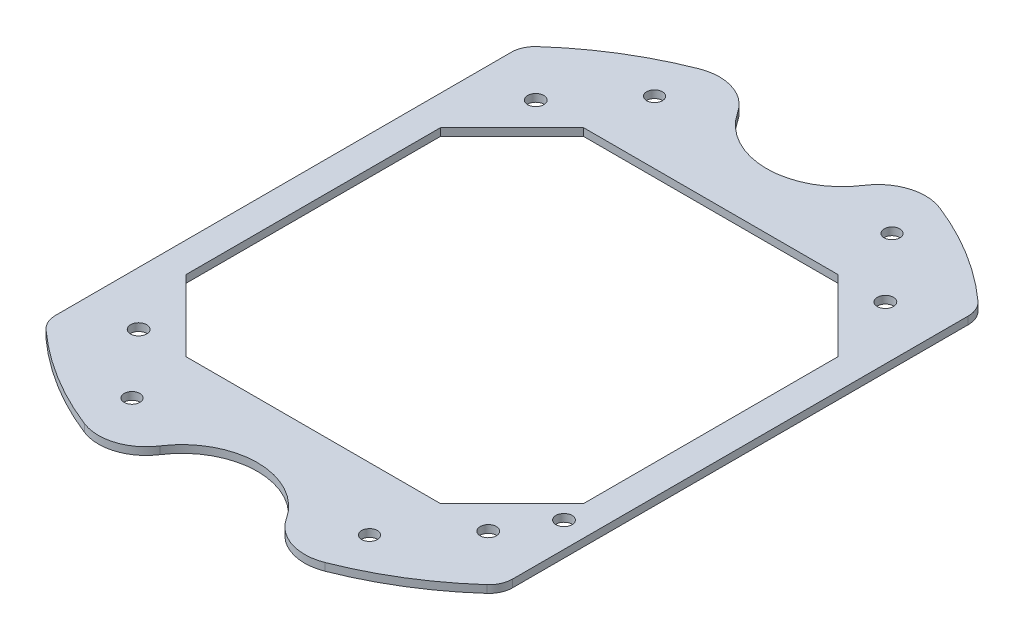
ISO-10303-21;
HEADER;
FILE_DESCRIPTION(('STEP AP214'),'2;1');
FILE_NAME('part.step','',(''),(''),'','','');
FILE_SCHEMA(('AUTOMOTIVE_DESIGN { 1 0 10303 214 1 1 1 1 }'));
ENDSEC;
DATA;
#1=APPLICATION_CONTEXT('core data for automotive mechanical design processes');
#2=APPLICATION_PROTOCOL_DEFINITION('international standard','automotive_design',2000,#1);
#3=PRODUCT_CONTEXT('',#1,'mechanical');
#4=PRODUCT('Part','Part','',(#3));
#5=PRODUCT_RELATED_PRODUCT_CATEGORY('part','',(#4));
#6=PRODUCT_DEFINITION_FORMATION('','',#4);
#7=PRODUCT_DEFINITION_CONTEXT('part definition',#1,'design');
#8=PRODUCT_DEFINITION('design','',#6,#7);
#9=PRODUCT_DEFINITION_SHAPE('','',#8);
#10=(LENGTH_UNIT() NAMED_UNIT(*) SI_UNIT(.MILLI.,.METRE.));
#11=(NAMED_UNIT(*) PLANE_ANGLE_UNIT() SI_UNIT($,.RADIAN.));
#12=(NAMED_UNIT(*) SI_UNIT($,.STERADIAN.) SOLID_ANGLE_UNIT());
#13=UNCERTAINTY_MEASURE_WITH_UNIT(LENGTH_MEASURE(1.E-05),#10,'distance_accuracy_value','');
#14=(GEOMETRIC_REPRESENTATION_CONTEXT(3) GLOBAL_UNCERTAINTY_ASSIGNED_CONTEXT((#13)) GLOBAL_UNIT_ASSIGNED_CONTEXT((#10,
#11,#12)) REPRESENTATION_CONTEXT('',''));
#15=CARTESIAN_POINT('',(0.,0.,0.));
#16=DIRECTION('',(0.,0.,1.));
#17=DIRECTION('',(1.,0.,0.));
#18=AXIS2_PLACEMENT_3D('',#15,#16,#17);
#19=CARTESIAN_POINT('',(21.6963601903997,-1.6,55.369936928702));
#20=DIRECTION('',(0.,1.,0.));
#21=DIRECTION('',(0.,0.,1.));
#22=AXIS2_PLACEMENT_3D('',#19,#20,#21);
#23=CYLINDRICAL_SURFACE('',#22,10.);
#24=CARTESIAN_POINT('',(21.6963601903997,0.,55.369936928702));
#25=DIRECTION('',(0.,1.,0.));
#26=DIRECTION('',(0.,0.,1.));
#27=AXIS2_PLACEMENT_3D('',#24,#25,#26);
#28=CIRCLE('',#27,10.);
#29=CARTESIAN_POINT('',(13.3112934501486,0.,60.8188501929717));
#30=VERTEX_POINT('',#29);
#31=CARTESIAN_POINT('',(25.3447081011431,0.,64.6806596462022));
#32=VERTEX_POINT('',#31);
#33=EDGE_CURVE('E419',#30,#32,#28,.T.);
#34=ORIENTED_EDGE('',*,*,#33,.F.);
#35=DIRECTION('',(0.,1.,0.));
#36=VECTOR('',#35,1.);
#37=CARTESIAN_POINT('',(13.3112934501486,-1.6,60.8188501929717));
#38=LINE('',#37,#36);
#39=CARTESIAN_POINT('',(13.3112934501486,-1.6,60.8188501929717));
#40=VERTEX_POINT('',#39);
#41=EDGE_CURVE('E12',#40,#30,#38,.T.);
#42=ORIENTED_EDGE('',*,*,#41,.F.);
#43=CARTESIAN_POINT('',(21.6963601903997,-1.6,55.369936928702));
#44=DIRECTION('',(0.,1.,0.));
#45=DIRECTION('',(0.,0.,1.));
#46=AXIS2_PLACEMENT_3D('',#43,#44,#45);
#47=CIRCLE('',#46,10.);
#48=CARTESIAN_POINT('',(25.3447081011431,-1.6,64.6806596462022));
#49=VERTEX_POINT('',#48);
#50=EDGE_CURVE('E420',#40,#49,#47,.T.);
#51=ORIENTED_EDGE('',*,*,#50,.T.);
#52=DIRECTION('',(0.,1.,0.));
#53=VECTOR('',#52,1.);
#54=CARTESIAN_POINT('',(25.3447081011431,-1.6,64.6806596462022));
#55=LINE('',#54,#53);
#56=EDGE_CURVE('E97',#49,#32,#55,.T.);
#57=ORIENTED_EDGE('',*,*,#56,.T.);
#58=EDGE_LOOP('',(#34,#42,#51,#57));
#59=FACE_BOUND('',#58,.T.);
#60=ADVANCED_FACE('F94',(#59),#23,.T.);
#61=CARTESIAN_POINT('',(0.,-1.6,69.469));
#62=DIRECTION('',(0.,1.,0.));
#63=DIRECTION('',(0.,0.,1.));
#64=AXIS2_PLACEMENT_3D('',#61,#62,#63);
#65=CYLINDRICAL_SURFACE('',#64,15.875);
#66=CARTESIAN_POINT('',(0.,0.,69.469));
#67=DIRECTION('',(0.,1.,0.));
#68=DIRECTION('',(0.,0.,1.));
#69=AXIS2_PLACEMENT_3D('',#66,#67,#68);
#70=CIRCLE('',#69,15.875);
#71=CARTESIAN_POINT('',(-13.3112934501486,0.,60.8188501929717));
#72=VERTEX_POINT('',#71);
#73=EDGE_CURVE('E425',#30,#72,#70,.T.);
#74=ORIENTED_EDGE('',*,*,#73,.T.);
#75=DIRECTION('',(0.,1.,0.));
#76=VECTOR('',#75,1.);
#77=CARTESIAN_POINT('',(-13.3112934501486,-1.6,60.8188501929717));
#78=LINE('',#77,#76);
#79=CARTESIAN_POINT('',(-13.3112934501486,-1.6,60.8188501929717));
#80=VERTEX_POINT('',#79);
#81=EDGE_CURVE('E103',#80,#72,#78,.T.);
#82=ORIENTED_EDGE('',*,*,#81,.F.);
#83=CARTESIAN_POINT('',(0.,-1.6,69.469));
#84=DIRECTION('',(0.,1.,0.));
#85=DIRECTION('',(0.,0.,1.));
#86=AXIS2_PLACEMENT_3D('',#83,#84,#85);
#87=CIRCLE('',#86,15.875);
#88=EDGE_CURVE('E475',#40,#80,#87,.T.);
#89=ORIENTED_EDGE('',*,*,#88,.F.);
#90=ORIENTED_EDGE('',*,*,#41,.T.);
#91=EDGE_LOOP('',(#74,#82,#89,#90));
#92=FACE_BOUND('',#91,.T.);
#93=ADVANCED_FACE('F594',(#92),#65,.F.);
#94=CARTESIAN_POINT('',(-21.6963601903997,-1.6,55.369936928702));
#95=DIRECTION('',(0.,1.,0.));
#96=DIRECTION('',(0.,0.,1.));
#97=AXIS2_PLACEMENT_3D('',#94,#95,#96);
#98=CYLINDRICAL_SURFACE('',#97,10.);
#99=CARTESIAN_POINT('',(-21.6963601903997,0.,55.369936928702));
#100=DIRECTION('',(0.,-1.,0.));
#101=DIRECTION('',(0.,0.,-1.));
#102=AXIS2_PLACEMENT_3D('',#99,#100,#101);
#103=CIRCLE('',#102,10.);
#104=CARTESIAN_POINT('',(-25.3447081011431,0.,64.6806596462022));
#105=VERTEX_POINT('',#104);
#106=EDGE_CURVE('E531',#72,#105,#103,.T.);
#107=ORIENTED_EDGE('',*,*,#106,.T.);
#108=DIRECTION('',(0.,1.,0.));
#109=VECTOR('',#108,1.);
#110=CARTESIAN_POINT('',(-25.3447081011431,-1.6,64.6806596462022));
#111=LINE('',#110,#109);
#112=CARTESIAN_POINT('',(-25.3447081011431,-1.6,64.6806596462022));
#113=VERTEX_POINT('',#112);
#114=EDGE_CURVE('E540',#113,#105,#111,.T.);
#115=ORIENTED_EDGE('',*,*,#114,.F.);
#116=CARTESIAN_POINT('',(-21.6963601903997,-1.6,55.369936928702));
#117=DIRECTION('',(0.,-1.,0.));
#118=DIRECTION('',(0.,0.,-1.));
#119=AXIS2_PLACEMENT_3D('',#116,#117,#118);
#120=CIRCLE('',#119,10.);
#121=EDGE_CURVE('E472',#80,#113,#120,.T.);
#122=ORIENTED_EDGE('',*,*,#121,.F.);
#123=ORIENTED_EDGE('',*,*,#81,.T.);
#124=EDGE_LOOP('',(#107,#115,#122,#123));
#125=FACE_BOUND('',#124,.T.);
#126=ADVANCED_FACE('F598',(#125),#98,.T.);
#127=CARTESIAN_POINT('',(0.,-1.6,0.));
#128=DIRECTION('',(0.,1.,0.));
#129=DIRECTION('',(0.,0.,1.));
#130=AXIS2_PLACEMENT_3D('',#127,#128,#129);
#131=CYLINDRICAL_SURFACE('',#130,69.469);
#132=CARTESIAN_POINT('',(0.,0.,0.));
#133=DIRECTION('',(0.,1.,0.));
#134=DIRECTION('',(0.,0.,1.));
#135=AXIS2_PLACEMENT_3D('',#132,#133,#134);
#136=CIRCLE('',#135,69.469);
#137=CARTESIAN_POINT('',(-46.4354728353846,0.,51.6690315716702));
#138=VERTEX_POINT('',#137);
#139=EDGE_CURVE('E527',#138,#105,#136,.T.);
#140=ORIENTED_EDGE('',*,*,#139,.F.);
#141=DIRECTION('',(0.,1.,0.));
#142=VECTOR('',#141,1.);
#143=CARTESIAN_POINT('',(-46.4354728353846,-1.6,51.6690315716702));
#144=LINE('',#143,#142);
#145=CARTESIAN_POINT('',(-46.4354728353846,-1.6,51.6690315716702));
#146=VERTEX_POINT('',#145);
#147=EDGE_CURVE('E543',#146,#138,#144,.T.);
#148=ORIENTED_EDGE('',*,*,#147,.F.);
#149=CARTESIAN_POINT('',(0.,-1.6,0.));
#150=DIRECTION('',(0.,1.,0.));
#151=DIRECTION('',(0.,0.,1.));
#152=AXIS2_PLACEMENT_3D('',#149,#150,#151);
#153=CIRCLE('',#152,69.469);
#154=EDGE_CURVE('E468',#146,#113,#153,.T.);
#155=ORIENTED_EDGE('',*,*,#154,.T.);
#156=ORIENTED_EDGE('',*,*,#114,.T.);
#157=EDGE_LOOP('',(#140,#148,#155,#156));
#158=FACE_BOUND('',#157,.T.);
#159=ADVANCED_FACE('F652',(#158),#131,.T.);
#160=CARTESIAN_POINT('',(-43.0933005833452,-1.6,47.9501762857391));
#161=DIRECTION('',(0.,1.,0.));
#162=DIRECTION('',(0.,0.,1.));
#163=AXIS2_PLACEMENT_3D('',#160,#161,#162);
#164=CYLINDRICAL_SURFACE('',#163,5.00000000000002);
#165=CARTESIAN_POINT('',(-43.0933005833452,0.,47.9501762857391));
#166=DIRECTION('',(0.,1.,0.));
#167=DIRECTION('',(0.,0.,1.));
#168=AXIS2_PLACEMENT_3D('',#165,#166,#167);
#169=CIRCLE('',#168,5.00000000000002);
#170=CARTESIAN_POINT('',(-48.0933005833453,0.,47.9501762857391));
#171=VERTEX_POINT('',#170);
#172=EDGE_CURVE('E523',#171,#138,#169,.T.);
#173=ORIENTED_EDGE('',*,*,#172,.F.);
#174=DIRECTION('',(0.,1.,0.));
#175=VECTOR('',#174,1.);
#176=CARTESIAN_POINT('',(-48.0933005833453,-1.6,47.9501762857391));
#177=LINE('',#176,#175);
#178=CARTESIAN_POINT('',(-48.0933005833453,-1.6,47.9501762857391));
#179=VERTEX_POINT('',#178);
#180=EDGE_CURVE('E546',#179,#171,#177,.T.);
#181=ORIENTED_EDGE('',*,*,#180,.F.);
#182=CARTESIAN_POINT('',(-43.0933005833452,-1.6,47.9501762857391));
#183=DIRECTION('',(0.,1.,0.));
#184=DIRECTION('',(0.,0.,1.));
#185=AXIS2_PLACEMENT_3D('',#182,#183,#184);
#186=CIRCLE('',#185,5.00000000000002);
#187=EDGE_CURVE('E464',#179,#146,#186,.T.);
#188=ORIENTED_EDGE('',*,*,#187,.T.);
#189=ORIENTED_EDGE('',*,*,#147,.T.);
#190=EDGE_LOOP('',(#173,#181,#188,#189));
#191=FACE_BOUND('',#190,.T.);
#192=ADVANCED_FACE('F649',(#191),#164,.T.);
#193=CARTESIAN_POINT('',(-48.0933005833453,-1.6,47.9501762857391));
#194=DIRECTION('',(1.,0.,0.));
#195=DIRECTION('',(0.,0.,-1.));
#196=AXIS2_PLACEMENT_3D('',#193,#194,#195);
#197=PLANE('',#196);
#198=DIRECTION('',(0.,0.,-1.));
#199=VECTOR('',#198,1.);
#200=CARTESIAN_POINT('',(-48.0933005833453,0.,47.9501762857391));
#201=LINE('',#200,#199);
#202=CARTESIAN_POINT('',(-48.0933005833453,0.,-47.9501762857391));
#203=VERTEX_POINT('',#202);
#204=EDGE_CURVE('E520',#171,#203,#201,.T.);
#205=ORIENTED_EDGE('',*,*,#204,.T.);
#206=DIRECTION('',(0.,1.,0.));
#207=VECTOR('',#206,1.);
#208=CARTESIAN_POINT('',(-48.0933005833453,-1.6,-47.9501762857391));
#209=LINE('',#208,#207);
#210=CARTESIAN_POINT('',(-48.0933005833453,-1.6,-47.9501762857391));
#211=VERTEX_POINT('',#210);
#212=EDGE_CURVE('E549',#211,#203,#209,.T.);
#213=ORIENTED_EDGE('',*,*,#212,.F.);
#214=DIRECTION('',(0.,0.,-1.));
#215=VECTOR('',#214,1.);
#216=CARTESIAN_POINT('',(-48.0933005833453,-1.6,47.9501762857391));
#217=LINE('',#216,#215);
#218=EDGE_CURVE('E461',#179,#211,#217,.T.);
#219=ORIENTED_EDGE('',*,*,#218,.F.);
#220=ORIENTED_EDGE('',*,*,#180,.T.);
#221=EDGE_LOOP('',(#205,#213,#219,#220));
#222=FACE_BOUND('',#221,.T.);
#223=ADVANCED_FACE('F647',(#222),#197,.F.);
#224=CARTESIAN_POINT('',(-43.0933005833452,-1.6,-47.9501762857391));
#225=DIRECTION('',(0.,1.,0.));
#226=DIRECTION('',(0.,0.,1.));
#227=AXIS2_PLACEMENT_3D('',#224,#225,#226);
#228=CYLINDRICAL_SURFACE('',#227,5.00000000000002);
#229=CARTESIAN_POINT('',(-43.0933005833452,0.,-47.9501762857391));
#230=DIRECTION('',(0.,-1.,0.));
#231=DIRECTION('',(0.,0.,-1.));
#232=AXIS2_PLACEMENT_3D('',#229,#230,#231);
#233=CIRCLE('',#232,5.00000000000002);
#234=CARTESIAN_POINT('',(-46.4354728353846,0.,-51.6690315716702));
#235=VERTEX_POINT('',#234);
#236=EDGE_CURVE('E516',#203,#235,#233,.T.);
#237=ORIENTED_EDGE('',*,*,#236,.T.);
#238=DIRECTION('',(0.,1.,0.));
#239=VECTOR('',#238,1.);
#240=CARTESIAN_POINT('',(-46.4354728353846,-1.6,-51.6690315716702));
#241=LINE('',#240,#239);
#242=CARTESIAN_POINT('',(-46.4354728353846,-1.6,-51.6690315716702));
#243=VERTEX_POINT('',#242);
#244=EDGE_CURVE('E553',#243,#235,#241,.T.);
#245=ORIENTED_EDGE('',*,*,#244,.F.);
#246=CARTESIAN_POINT('',(-43.0933005833452,-1.6,-47.9501762857391));
#247=DIRECTION('',(0.,-1.,0.));
#248=DIRECTION('',(0.,0.,-1.));
#249=AXIS2_PLACEMENT_3D('',#246,#247,#248);
#250=CIRCLE('',#249,5.00000000000002);
#251=EDGE_CURVE('E458',#211,#243,#250,.T.);
#252=ORIENTED_EDGE('',*,*,#251,.F.);
#253=ORIENTED_EDGE('',*,*,#212,.T.);
#254=EDGE_LOOP('',(#237,#245,#252,#253));
#255=FACE_BOUND('',#254,.T.);
#256=ADVANCED_FACE('F642',(#255),#228,.T.);
#257=CARTESIAN_POINT('',(0.,-1.6,0.));
#258=DIRECTION('',(0.,1.,0.));
#259=DIRECTION('',(0.,0.,1.));
#260=AXIS2_PLACEMENT_3D('',#257,#258,#259);
#261=CYLINDRICAL_SURFACE('',#260,69.469);
#262=CARTESIAN_POINT('',(0.,0.,0.));
#263=DIRECTION('',(0.,1.,0.));
#264=DIRECTION('',(0.,0.,1.));
#265=AXIS2_PLACEMENT_3D('',#262,#263,#264);
#266=CIRCLE('',#265,69.469);
#267=CARTESIAN_POINT('',(-25.3447081011431,0.,-64.6806596462022));
#268=VERTEX_POINT('',#267);
#269=EDGE_CURVE('E512',#268,#235,#266,.T.);
#270=ORIENTED_EDGE('',*,*,#269,.F.);
#271=DIRECTION('',(0.,1.,0.));
#272=VECTOR('',#271,1.);
#273=CARTESIAN_POINT('',(-25.3447081011431,-1.6,-64.6806596462022));
#274=LINE('',#273,#272);
#275=CARTESIAN_POINT('',(-25.3447081011431,-1.6,-64.6806596462022));
#276=VERTEX_POINT('',#275);
#277=EDGE_CURVE('E556',#276,#268,#274,.T.);
#278=ORIENTED_EDGE('',*,*,#277,.F.);
#279=CARTESIAN_POINT('',(0.,-1.6,0.));
#280=DIRECTION('',(0.,1.,0.));
#281=DIRECTION('',(0.,0.,1.));
#282=AXIS2_PLACEMENT_3D('',#279,#280,#281);
#283=CIRCLE('',#282,69.469);
#284=EDGE_CURVE('E454',#276,#243,#283,.T.);
#285=ORIENTED_EDGE('',*,*,#284,.T.);
#286=ORIENTED_EDGE('',*,*,#244,.T.);
#287=EDGE_LOOP('',(#270,#278,#285,#286));
#288=FACE_BOUND('',#287,.T.);
#289=ADVANCED_FACE('F636',(#288),#261,.T.);
#290=CARTESIAN_POINT('',(-21.6963601903997,-1.6,-55.369936928702));
#291=DIRECTION('',(0.,1.,0.));
#292=DIRECTION('',(0.,0.,1.));
#293=AXIS2_PLACEMENT_3D('',#290,#291,#292);
#294=CYLINDRICAL_SURFACE('',#293,10.);
#295=CARTESIAN_POINT('',(-21.6963601903997,0.,-55.369936928702));
#296=DIRECTION('',(0.,1.,0.));
#297=DIRECTION('',(0.,0.,1.));
#298=AXIS2_PLACEMENT_3D('',#295,#296,#297);
#299=CIRCLE('',#298,10.);
#300=CARTESIAN_POINT('',(-13.3112934501486,0.,-60.8188501929717));
#301=VERTEX_POINT('',#300);
#302=EDGE_CURVE('E508',#301,#268,#299,.T.);
#303=ORIENTED_EDGE('',*,*,#302,.F.);
#304=DIRECTION('',(0.,1.,0.));
#305=VECTOR('',#304,1.);
#306=CARTESIAN_POINT('',(-13.3112934501486,-1.6,-60.8188501929717));
#307=LINE('',#306,#305);
#308=CARTESIAN_POINT('',(-13.3112934501486,-1.6,-60.8188501929717));
#309=VERTEX_POINT('',#308);
#310=EDGE_CURVE('E559',#309,#301,#307,.T.);
#311=ORIENTED_EDGE('',*,*,#310,.F.);
#312=CARTESIAN_POINT('',(-21.6963601903997,-1.6,-55.369936928702));
#313=DIRECTION('',(0.,1.,0.));
#314=DIRECTION('',(0.,0.,1.));
#315=AXIS2_PLACEMENT_3D('',#312,#313,#314);
#316=CIRCLE('',#315,10.);
#317=EDGE_CURVE('E450',#309,#276,#316,.T.);
#318=ORIENTED_EDGE('',*,*,#317,.T.);
#319=ORIENTED_EDGE('',*,*,#277,.T.);
#320=EDGE_LOOP('',(#303,#311,#318,#319));
#321=FACE_BOUND('',#320,.T.);
#322=ADVANCED_FACE('F632',(#321),#294,.T.);
#323=CARTESIAN_POINT('',(0.,-1.6,-69.469));
#324=DIRECTION('',(0.,1.,0.));
#325=DIRECTION('',(0.,0.,1.));
#326=AXIS2_PLACEMENT_3D('',#323,#324,#325);
#327=CYLINDRICAL_SURFACE('',#326,15.875);
#328=CARTESIAN_POINT('',(0.,0.,-69.469));
#329=DIRECTION('',(0.,1.,0.));
#330=DIRECTION('',(0.,0.,1.));
#331=AXIS2_PLACEMENT_3D('',#328,#329,#330);
#332=CIRCLE('',#331,15.875);
#333=CARTESIAN_POINT('',(13.3112934501486,0.,-60.8188501929717));
#334=VERTEX_POINT('',#333);
#335=EDGE_CURVE('E505',#301,#334,#332,.T.);
#336=ORIENTED_EDGE('',*,*,#335,.T.);
#337=DIRECTION('',(0.,1.,0.));
#338=VECTOR('',#337,1.);
#339=CARTESIAN_POINT('',(13.3112934501486,-1.6,-60.8188501929717));
#340=LINE('',#339,#338);
#341=CARTESIAN_POINT('',(13.3112934501486,-1.6,-60.8188501929717));
#342=VERTEX_POINT('',#341);
#343=EDGE_CURVE('E562',#342,#334,#340,.T.);
#344=ORIENTED_EDGE('',*,*,#343,.F.);
#345=CARTESIAN_POINT('',(0.,-1.6,-69.469));
#346=DIRECTION('',(0.,1.,0.));
#347=DIRECTION('',(0.,0.,1.));
#348=AXIS2_PLACEMENT_3D('',#345,#346,#347);
#349=CIRCLE('',#348,15.875);
#350=EDGE_CURVE('E447',#309,#342,#349,.T.);
#351=ORIENTED_EDGE('',*,*,#350,.F.);
#352=ORIENTED_EDGE('',*,*,#310,.T.);
#353=EDGE_LOOP('',(#336,#344,#351,#352));
#354=FACE_BOUND('',#353,.T.);
#355=ADVANCED_FACE('F628',(#354),#327,.F.);
#356=CARTESIAN_POINT('',(21.6963601903997,-1.6,-55.369936928702));
#357=DIRECTION('',(0.,1.,0.));
#358=DIRECTION('',(0.,0.,1.));
#359=AXIS2_PLACEMENT_3D('',#356,#357,#358);
#360=CYLINDRICAL_SURFACE('',#359,10.);
#361=CARTESIAN_POINT('',(21.6963601903997,0.,-55.369936928702));
#362=DIRECTION('',(0.,-1.,0.));
#363=DIRECTION('',(0.,0.,-1.));
#364=AXIS2_PLACEMENT_3D('',#361,#362,#363);
#365=CIRCLE('',#364,10.);
#366=CARTESIAN_POINT('',(25.3447081011431,0.,-64.6806596462022));
#367=VERTEX_POINT('',#366);
#368=EDGE_CURVE('E501',#334,#367,#365,.T.);
#369=ORIENTED_EDGE('',*,*,#368,.T.);
#370=DIRECTION('',(0.,1.,0.));
#371=VECTOR('',#370,1.);
#372=CARTESIAN_POINT('',(25.3447081011431,-1.6,-64.6806596462022));
#373=LINE('',#372,#371);
#374=CARTESIAN_POINT('',(25.3447081011431,-1.6,-64.6806596462022));
#375=VERTEX_POINT('',#374);
#376=EDGE_CURVE('E566',#375,#367,#373,.T.);
#377=ORIENTED_EDGE('',*,*,#376,.F.);
#378=CARTESIAN_POINT('',(21.6963601903997,-1.6,-55.369936928702));
#379=DIRECTION('',(0.,-1.,0.));
#380=DIRECTION('',(0.,0.,-1.));
#381=AXIS2_PLACEMENT_3D('',#378,#379,#380);
#382=CIRCLE('',#381,10.);
#383=EDGE_CURVE('E444',#342,#375,#382,.T.);
#384=ORIENTED_EDGE('',*,*,#383,.F.);
#385=ORIENTED_EDGE('',*,*,#343,.T.);
#386=EDGE_LOOP('',(#369,#377,#384,#385));
#387=FACE_BOUND('',#386,.T.);
#388=ADVANCED_FACE('F624',(#387),#360,.T.);
#389=CARTESIAN_POINT('',(0.,-1.6,0.));
#390=DIRECTION('',(0.,1.,0.));
#391=DIRECTION('',(0.,0.,1.));
#392=AXIS2_PLACEMENT_3D('',#389,#390,#391);
#393=CYLINDRICAL_SURFACE('',#392,69.469);
#394=CARTESIAN_POINT('',(0.,0.,0.));
#395=DIRECTION('',(0.,1.,0.));
#396=DIRECTION('',(0.,0.,1.));
#397=AXIS2_PLACEMENT_3D('',#394,#395,#396);
#398=CIRCLE('',#397,69.469);
#399=CARTESIAN_POINT('',(46.4354728353846,0.,-51.6690315716702));
#400=VERTEX_POINT('',#399);
#401=EDGE_CURVE('E497',#400,#367,#398,.T.);
#402=ORIENTED_EDGE('',*,*,#401,.F.);
#403=DIRECTION('',(0.,1.,0.));
#404=VECTOR('',#403,1.);
#405=CARTESIAN_POINT('',(46.4354728353846,-1.6,-51.6690315716702));
#406=LINE('',#405,#404);
#407=CARTESIAN_POINT('',(46.4354728353846,-1.6,-51.6690315716702));
#408=VERTEX_POINT('',#407);
#409=EDGE_CURVE('E569',#408,#400,#406,.T.);
#410=ORIENTED_EDGE('',*,*,#409,.F.);
#411=CARTESIAN_POINT('',(0.,-1.6,0.));
#412=DIRECTION('',(0.,1.,0.));
#413=DIRECTION('',(0.,0.,1.));
#414=AXIS2_PLACEMENT_3D('',#411,#412,#413);
#415=CIRCLE('',#414,69.469);
#416=EDGE_CURVE('E440',#408,#375,#415,.T.);
#417=ORIENTED_EDGE('',*,*,#416,.T.);
#418=ORIENTED_EDGE('',*,*,#376,.T.);
#419=EDGE_LOOP('',(#402,#410,#417,#418));
#420=FACE_BOUND('',#419,.T.);
#421=ADVANCED_FACE('F619',(#420),#393,.T.);
#422=CARTESIAN_POINT('',(43.0933005833453,-1.6,-47.9501762857391));
#423=DIRECTION('',(0.,1.,0.));
#424=DIRECTION('',(0.,0.,1.));
#425=AXIS2_PLACEMENT_3D('',#422,#423,#424);
#426=CYLINDRICAL_SURFACE('',#425,5.);
#427=CARTESIAN_POINT('',(43.0933005833453,0.,-47.9501762857391));
#428=DIRECTION('',(0.,1.,0.));
#429=DIRECTION('',(0.,0.,1.));
#430=AXIS2_PLACEMENT_3D('',#427,#428,#429);
#431=CIRCLE('',#430,5.);
#432=CARTESIAN_POINT('',(48.0933005833453,0.,-47.9501762857391));
#433=VERTEX_POINT('',#432);
#434=EDGE_CURVE('E493',#433,#400,#431,.T.);
#435=ORIENTED_EDGE('',*,*,#434,.F.);
#436=DIRECTION('',(0.,1.,0.));
#437=VECTOR('',#436,1.);
#438=CARTESIAN_POINT('',(48.0933005833453,-1.6,-47.9501762857391));
#439=LINE('',#438,#437);
#440=CARTESIAN_POINT('',(48.0933005833453,-1.6,-47.9501762857391));
#441=VERTEX_POINT('',#440);
#442=EDGE_CURVE('E572',#441,#433,#439,.T.);
#443=ORIENTED_EDGE('',*,*,#442,.F.);
#444=CARTESIAN_POINT('',(43.0933005833453,-1.6,-47.9501762857391));
#445=DIRECTION('',(0.,1.,0.));
#446=DIRECTION('',(0.,0.,1.));
#447=AXIS2_PLACEMENT_3D('',#444,#445,#446);
#448=CIRCLE('',#447,5.);
#449=EDGE_CURVE('E436',#441,#408,#448,.T.);
#450=ORIENTED_EDGE('',*,*,#449,.T.);
#451=ORIENTED_EDGE('',*,*,#409,.T.);
#452=EDGE_LOOP('',(#435,#443,#450,#451));
#453=FACE_BOUND('',#452,.T.);
#454=ADVANCED_FACE('F614',(#453),#426,.T.);
#455=CARTESIAN_POINT('',(48.0933005833453,-1.6,47.9501762857391));
#456=DIRECTION('',(1.,0.,0.));
#457=DIRECTION('',(0.,0.,-1.));
#458=AXIS2_PLACEMENT_3D('',#455,#456,#457);
#459=PLANE('',#458);
#460=DIRECTION('',(0.,0.,-1.));
#461=VECTOR('',#460,1.);
#462=CARTESIAN_POINT('',(48.0933005833453,0.,47.9501762857391));
#463=LINE('',#462,#461);
#464=CARTESIAN_POINT('',(48.0933005833453,0.,47.9501762857391));
#465=VERTEX_POINT('',#464);
#466=EDGE_CURVE('E489',#465,#433,#463,.T.);
#467=ORIENTED_EDGE('',*,*,#466,.F.);
#468=DIRECTION('',(0.,1.,0.));
#469=VECTOR('',#468,1.);
#470=CARTESIAN_POINT('',(48.0933005833453,-1.6,47.9501762857391));
#471=LINE('',#470,#469);
#472=CARTESIAN_POINT('',(48.0933005833453,-1.6,47.9501762857391));
#473=VERTEX_POINT('',#472);
#474=EDGE_CURVE('E575',#473,#465,#471,.T.);
#475=ORIENTED_EDGE('',*,*,#474,.F.);
#476=DIRECTION('',(0.,0.,-1.));
#477=VECTOR('',#476,1.);
#478=CARTESIAN_POINT('',(48.0933005833453,-1.6,47.9501762857391));
#479=LINE('',#478,#477);
#480=EDGE_CURVE('E432',#473,#441,#479,.T.);
#481=ORIENTED_EDGE('',*,*,#480,.T.);
#482=ORIENTED_EDGE('',*,*,#442,.T.);
#483=EDGE_LOOP('',(#467,#475,#481,#482));
#484=FACE_BOUND('',#483,.T.);
#485=ADVANCED_FACE('F611',(#484),#459,.T.);
#486=CARTESIAN_POINT('',(43.0933005833453,-1.6,47.9501762857391));
#487=DIRECTION('',(0.,1.,0.));
#488=DIRECTION('',(0.,0.,1.));
#489=AXIS2_PLACEMENT_3D('',#486,#487,#488);
#490=CYLINDRICAL_SURFACE('',#489,5.);
#491=CARTESIAN_POINT('',(43.0933005833453,0.,47.9501762857391));
#492=DIRECTION('',(0.,-1.,0.));
#493=DIRECTION('',(0.,0.,-1.));
#494=AXIS2_PLACEMENT_3D('',#491,#492,#493);
#495=CIRCLE('',#494,5.);
#496=CARTESIAN_POINT('',(46.4354728353846,0.,51.6690315716702));
#497=VERTEX_POINT('',#496);
#498=EDGE_CURVE('E485',#465,#497,#495,.T.);
#499=ORIENTED_EDGE('',*,*,#498,.T.);
#500=DIRECTION('',(0.,1.,0.));
#501=VECTOR('',#500,1.);
#502=CARTESIAN_POINT('',(46.4354728353846,-1.6,51.6690315716702));
#503=LINE('',#502,#501);
#504=CARTESIAN_POINT('',(46.4354728353846,-1.6,51.6690315716702));
#505=VERTEX_POINT('',#504);
#506=EDGE_CURVE('E577',#505,#497,#503,.T.);
#507=ORIENTED_EDGE('',*,*,#506,.F.);
#508=CARTESIAN_POINT('',(43.0933005833453,-1.6,47.9501762857391));
#509=DIRECTION('',(0.,-1.,0.));
#510=DIRECTION('',(0.,0.,-1.));
#511=AXIS2_PLACEMENT_3D('',#508,#509,#510);
#512=CIRCLE('',#511,5.);
#513=EDGE_CURVE('E429',#473,#505,#512,.T.);
#514=ORIENTED_EDGE('',*,*,#513,.F.);
#515=ORIENTED_EDGE('',*,*,#474,.T.);
#516=EDGE_LOOP('',(#499,#507,#514,#515));
#517=FACE_BOUND('',#516,.T.);
#518=ADVANCED_FACE('F608',(#517),#490,.T.);
#519=CARTESIAN_POINT('',(0.,-1.6,0.));
#520=DIRECTION('',(0.,1.,0.));
#521=DIRECTION('',(0.,0.,1.));
#522=AXIS2_PLACEMENT_3D('',#519,#520,#521);
#523=CYLINDRICAL_SURFACE('',#522,69.469);
#524=CARTESIAN_POINT('',(0.,0.,0.));
#525=DIRECTION('',(0.,1.,0.));
#526=DIRECTION('',(0.,0.,1.));
#527=AXIS2_PLACEMENT_3D('',#524,#525,#526);
#528=CIRCLE('',#527,69.469);
#529=EDGE_CURVE('E481',#32,#497,#528,.T.);
#530=ORIENTED_EDGE('',*,*,#529,.F.);
#531=ORIENTED_EDGE('',*,*,#56,.F.);
#532=CARTESIAN_POINT('',(0.,-1.6,0.));
#533=DIRECTION('',(0.,1.,0.));
#534=DIRECTION('',(0.,0.,1.));
#535=AXIS2_PLACEMENT_3D('',#532,#533,#534);
#536=CIRCLE('',#535,69.469);
#537=EDGE_CURVE('E424',#49,#505,#536,.T.);
#538=ORIENTED_EDGE('',*,*,#537,.T.);
#539=ORIENTED_EDGE('',*,*,#506,.T.);
#540=EDGE_LOOP('',(#530,#531,#538,#539));
#541=FACE_BOUND('',#540,.T.);
#542=ADVANCED_FACE('F587',(#541),#523,.T.);
#543=CARTESIAN_POINT('',(21.6963601903997,-1.6,55.369936928702));
#544=DIRECTION('',(0.,1.,0.));
#545=DIRECTION('',(0.,0.,1.));
#546=AXIS2_PLACEMENT_3D('',#543,#544,#545);
#547=PLANE('',#546);
#548=DIRECTION('',(-0.707106781186548,0.,-0.707106781186548));
#549=VECTOR('',#548,1.);
#550=CARTESIAN_POINT('',(4.23314855955086,-1.6,72.8331485595508));
#551=LINE('',#550,#549);
#552=CARTESIAN_POINT('',(-26.8,-1.6,41.8));
#553=VERTEX_POINT('',#552);
#554=CARTESIAN_POINT('',(-41.8,-1.6,26.8));
#555=VERTEX_POINT('',#554);
#556=EDGE_CURVE('E304',#553,#555,#551,.T.);
#557=ORIENTED_EDGE('',*,*,#556,.F.);
#558=DIRECTION('',(1.,0.,0.));
#559=VECTOR('',#558,1.);
#560=CARTESIAN_POINT('',(21.6963601903997,-1.6,41.8));
#561=LINE('',#560,#559);
#562=CARTESIAN_POINT('',(26.8,-1.6,41.8));
#563=VERTEX_POINT('',#562);
#564=EDGE_CURVE('E262',#553,#563,#561,.T.);
#565=ORIENTED_EDGE('',*,*,#564,.T.);
#566=DIRECTION('',(0.707106781186547,0.,-0.707106781186548));
#567=VECTOR('',#566,1.);
#568=CARTESIAN_POINT('',(17.4632116308489,-1.6,51.1367883691511));
#569=LINE('',#568,#567);
#570=CARTESIAN_POINT('',(41.8,-1.6,26.8));
#571=VERTEX_POINT('',#570);
#572=EDGE_CURVE('E341',#563,#571,#569,.T.);
#573=ORIENTED_EDGE('',*,*,#572,.T.);
#574=DIRECTION('',(0.,0.,-1.));
#575=VECTOR('',#574,1.);
#576=CARTESIAN_POINT('',(41.8,-1.6,55.369936928702));
#577=LINE('',#576,#575);
#578=CARTESIAN_POINT('',(41.8,-1.6,-26.8));
#579=VERTEX_POINT('',#578);
#580=EDGE_CURVE('E337',#571,#579,#577,.T.);
#581=ORIENTED_EDGE('',*,*,#580,.T.);
#582=DIRECTION('',(-0.707106781186548,0.,-0.707106781186548));
#583=VECTOR('',#582,1.);
#584=CARTESIAN_POINT('',(72.8331485595508,-1.6,4.23314855955088));
#585=LINE('',#584,#583);
#586=CARTESIAN_POINT('',(26.8,-1.6,-41.8));
#587=VERTEX_POINT('',#586);
#588=EDGE_CURVE('E333',#579,#587,#585,.T.);
#589=ORIENTED_EDGE('',*,*,#588,.T.);
#590=DIRECTION('',(1.,0.,0.));
#591=VECTOR('',#590,1.);
#592=CARTESIAN_POINT('',(21.6963601903997,-1.6,-41.8));
#593=LINE('',#592,#591);
#594=CARTESIAN_POINT('',(-26.8,-1.6,-41.8));
#595=VERTEX_POINT('',#594);
#596=EDGE_CURVE('E330',#595,#587,#593,.T.);
#597=ORIENTED_EDGE('',*,*,#596,.F.);
#598=DIRECTION('',(0.707106781186548,0.,-0.707106781186548));
#599=VECTOR('',#598,1.);
#600=CARTESIAN_POINT('',(-51.1367883691511,-1.6,-17.4632116308488));
#601=LINE('',#600,#599);
#602=CARTESIAN_POINT('',(-41.8,-1.6,-26.8));
#603=VERTEX_POINT('',#602);
#604=EDGE_CURVE('E327',#603,#595,#601,.T.);
#605=ORIENTED_EDGE('',*,*,#604,.F.);
#606=DIRECTION('',(0.,0.,-1.));
#607=VECTOR('',#606,1.);
#608=CARTESIAN_POINT('',(-41.8,-1.6,55.369936928702));
#609=LINE('',#608,#607);
#610=EDGE_CURVE('E324',#555,#603,#609,.T.);
#611=ORIENTED_EDGE('',*,*,#610,.F.);
#612=EDGE_LOOP('',(#557,#565,#573,#581,#589,#597,#605,#611));
#613=FACE_BOUND('',#612,.T.);
#614=CARTESIAN_POINT('',(42.75,-1.6,31.8));
#615=DIRECTION('',(0.,1.,0.));
#616=DIRECTION('',(0.,0.,1.));
#617=AXIS2_PLACEMENT_3D('',#614,#615,#616);
#618=CIRCLE('',#617,1.7);
#619=CARTESIAN_POINT('',(42.75,-1.6,33.5));
#620=VERTEX_POINT('',#619);
#621=EDGE_CURVE('E348',#620,#620,#618,.T.);
#622=ORIENTED_EDGE('',*,*,#621,.T.);
#623=EDGE_LOOP('',(#622));
#624=FACE_BOUND('',#623,.T.);
#625=CARTESIAN_POINT('',(-25.,-1.6,-55.));
#626=DIRECTION('',(0.,1.,0.));
#627=DIRECTION('',(0.,0.,1.));
#628=AXIS2_PLACEMENT_3D('',#625,#626,#627);
#629=CIRCLE('',#628,1.65);
#630=CARTESIAN_POINT('',(-25.,-1.6,-53.35));
#631=VERTEX_POINT('',#630);
#632=EDGE_CURVE('E359',#631,#631,#629,.T.);
#633=ORIENTED_EDGE('',*,*,#632,.T.);
#634=EDGE_LOOP('',(#633));
#635=FACE_BOUND('',#634,.T.);
#636=CARTESIAN_POINT('',(25.,-1.6,-55.));
#637=DIRECTION('',(0.,1.,0.));
#638=DIRECTION('',(0.,0.,1.));
#639=AXIS2_PLACEMENT_3D('',#636,#637,#638);
#640=CIRCLE('',#639,1.65);
#641=CARTESIAN_POINT('',(25.,-1.6,-53.35));
#642=VERTEX_POINT('',#641);
#643=EDGE_CURVE('E367',#642,#642,#640,.T.);
#644=ORIENTED_EDGE('',*,*,#643,.T.);
#645=EDGE_LOOP('',(#644));
#646=FACE_BOUND('',#645,.T.);
#647=CARTESIAN_POINT('',(25.,-1.6,55.));
#648=DIRECTION('',(0.,1.,0.));
#649=DIRECTION('',(0.,0.,1.));
#650=AXIS2_PLACEMENT_3D('',#647,#648,#649);
#651=CIRCLE('',#650,1.65);
#652=CARTESIAN_POINT('',(25.,-1.6,56.65));
#653=VERTEX_POINT('',#652);
#654=EDGE_CURVE('E375',#653,#653,#651,.T.);
#655=ORIENTED_EDGE('',*,*,#654,.T.);
#656=EDGE_LOOP('',(#655));
#657=FACE_BOUND('',#656,.T.);
#658=CARTESIAN_POINT('',(-25.,-1.6,55.));
#659=DIRECTION('',(0.,1.,0.));
#660=DIRECTION('',(0.,0.,1.));
#661=AXIS2_PLACEMENT_3D('',#658,#659,#660);
#662=CIRCLE('',#661,1.65);
#663=CARTESIAN_POINT('',(-25.,-1.6,56.65));
#664=VERTEX_POINT('',#663);
#665=EDGE_CURVE('E383',#664,#664,#662,.T.);
#666=ORIENTED_EDGE('',*,*,#665,.T.);
#667=EDGE_LOOP('',(#666));
#668=FACE_BOUND('',#667,.T.);
#669=CARTESIAN_POINT('',(-36.8,-1.6,-41.8));
#670=DIRECTION('',(0.,1.,0.));
#671=DIRECTION('',(0.,0.,1.));
#672=AXIS2_PLACEMENT_3D('',#669,#670,#671);
#673=CIRCLE('',#672,1.7);
#674=CARTESIAN_POINT('',(-36.8,-1.6,-40.1));
#675=VERTEX_POINT('',#674);
#676=EDGE_CURVE('E391',#675,#675,#673,.T.);
#677=ORIENTED_EDGE('',*,*,#676,.T.);
#678=EDGE_LOOP('',(#677));
#679=FACE_BOUND('',#678,.T.);
#680=CARTESIAN_POINT('',(-36.8,-1.6,41.8));
#681=DIRECTION('',(0.,1.,0.));
#682=DIRECTION('',(0.,0.,1.));
#683=AXIS2_PLACEMENT_3D('',#680,#681,#682);
#684=CIRCLE('',#683,1.7);
#685=CARTESIAN_POINT('',(-36.8,-1.6,43.5));
#686=VERTEX_POINT('',#685);
#687=EDGE_CURVE('E399',#686,#686,#684,.T.);
#688=ORIENTED_EDGE('',*,*,#687,.T.);
#689=EDGE_LOOP('',(#688));
#690=FACE_BOUND('',#689,.T.);
#691=CARTESIAN_POINT('',(36.8,-1.6,41.8));
#692=DIRECTION('',(0.,1.,0.));
#693=DIRECTION('',(0.,0.,1.));
#694=AXIS2_PLACEMENT_3D('',#691,#692,#693);
#695=CIRCLE('',#694,1.7);
#696=CARTESIAN_POINT('',(36.8,-1.6,43.5));
#697=VERTEX_POINT('',#696);
#698=EDGE_CURVE('E407',#697,#697,#695,.T.);
#699=ORIENTED_EDGE('',*,*,#698,.T.);
#700=EDGE_LOOP('',(#699));
#701=FACE_BOUND('',#700,.T.);
#702=CARTESIAN_POINT('',(36.8,-1.6,-41.8));
#703=DIRECTION('',(0.,1.,0.));
#704=DIRECTION('',(0.,0.,1.));
#705=AXIS2_PLACEMENT_3D('',#702,#703,#704);
#706=CIRCLE('',#705,1.7);
#707=CARTESIAN_POINT('',(36.8,-1.6,-40.1));
#708=VERTEX_POINT('',#707);
#709=EDGE_CURVE('E415',#708,#708,#706,.T.);
#710=ORIENTED_EDGE('',*,*,#709,.T.);
#711=EDGE_LOOP('',(#710));
#712=FACE_BOUND('',#711,.T.);
#713=ORIENTED_EDGE('',*,*,#50,.F.);
#714=ORIENTED_EDGE('',*,*,#88,.T.);
#715=ORIENTED_EDGE('',*,*,#121,.T.);
#716=ORIENTED_EDGE('',*,*,#154,.F.);
#717=ORIENTED_EDGE('',*,*,#187,.F.);
#718=ORIENTED_EDGE('',*,*,#218,.T.);
#719=ORIENTED_EDGE('',*,*,#251,.T.);
#720=ORIENTED_EDGE('',*,*,#284,.F.);
#721=ORIENTED_EDGE('',*,*,#317,.F.);
#722=ORIENTED_EDGE('',*,*,#350,.T.);
#723=ORIENTED_EDGE('',*,*,#383,.T.);
#724=ORIENTED_EDGE('',*,*,#416,.F.);
#725=ORIENTED_EDGE('',*,*,#449,.F.);
#726=ORIENTED_EDGE('',*,*,#480,.F.);
#727=ORIENTED_EDGE('',*,*,#513,.T.);
#728=ORIENTED_EDGE('',*,*,#537,.F.);
#729=EDGE_LOOP('',(#713,#714,#715,#716,#717,#718,#719,#720,#721,#722,#723,#724,#725,#726,#727,#728));
#730=FACE_BOUND('',#729,.T.);
#731=ADVANCED_FACE('F602',(#613,#624,#635,#646,#657,#668,#679,#690,#701,#712,#730),#547,.F.);
#732=CARTESIAN_POINT('',(21.6963601903997,0.,55.369936928702));
#733=DIRECTION('',(0.,1.,0.));
#734=DIRECTION('',(0.,0.,1.));
#735=AXIS2_PLACEMENT_3D('',#732,#733,#734);
#736=PLANE('',#735);
#737=DIRECTION('',(1.,0.,0.));
#738=VECTOR('',#737,1.);
#739=CARTESIAN_POINT('',(0.,0.,41.8));
#740=LINE('',#739,#738);
#741=CARTESIAN_POINT('',(-26.8,0.,41.8));
#742=VERTEX_POINT('',#741);
#743=CARTESIAN_POINT('',(26.8,0.,41.8));
#744=VERTEX_POINT('',#743);
#745=EDGE_CURVE('E259',#742,#744,#740,.T.);
#746=ORIENTED_EDGE('',*,*,#745,.F.);
#747=DIRECTION('',(-0.707106781186548,0.,-0.707106781186548));
#748=VECTOR('',#747,1.);
#749=CARTESIAN_POINT('',(-34.3,0.,34.3));
#750=LINE('',#749,#748);
#751=CARTESIAN_POINT('',(-41.8,0.,26.8));
#752=VERTEX_POINT('',#751);
#753=EDGE_CURVE('E268',#742,#752,#750,.T.);
#754=ORIENTED_EDGE('',*,*,#753,.T.);
#755=DIRECTION('',(0.,0.,-1.));
#756=VECTOR('',#755,1.);
#757=CARTESIAN_POINT('',(-41.8,0.,0.));
#758=LINE('',#757,#756);
#759=CARTESIAN_POINT('',(-41.8,0.,-26.8));
#760=VERTEX_POINT('',#759);
#761=EDGE_CURVE('E119',#752,#760,#758,.T.);
#762=ORIENTED_EDGE('',*,*,#761,.T.);
#763=DIRECTION('',(0.707106781186548,0.,-0.707106781186548));
#764=VECTOR('',#763,1.);
#765=CARTESIAN_POINT('',(-34.3,0.,-34.3));
#766=LINE('',#765,#764);
#767=CARTESIAN_POINT('',(-26.8,0.,-41.8));
#768=VERTEX_POINT('',#767);
#769=EDGE_CURVE('E296',#760,#768,#766,.T.);
#770=ORIENTED_EDGE('',*,*,#769,.T.);
#771=DIRECTION('',(1.,0.,0.));
#772=VECTOR('',#771,1.);
#773=CARTESIAN_POINT('',(0.,0.,-41.8));
#774=LINE('',#773,#772);
#775=CARTESIAN_POINT('',(26.8,0.,-41.8));
#776=VERTEX_POINT('',#775);
#777=EDGE_CURVE('E292',#768,#776,#774,.T.);
#778=ORIENTED_EDGE('',*,*,#777,.T.);
#779=DIRECTION('',(-0.707106781186548,0.,-0.707106781186548));
#780=VECTOR('',#779,1.);
#781=CARTESIAN_POINT('',(34.3,0.,-34.3));
#782=LINE('',#781,#780);
#783=CARTESIAN_POINT('',(41.8,0.,-26.8));
#784=VERTEX_POINT('',#783);
#785=EDGE_CURVE('E288',#784,#776,#782,.T.);
#786=ORIENTED_EDGE('',*,*,#785,.F.);
#787=DIRECTION('',(0.,0.,-1.));
#788=VECTOR('',#787,1.);
#789=CARTESIAN_POINT('',(41.8,0.,0.));
#790=LINE('',#789,#788);
#791=CARTESIAN_POINT('',(41.8,0.,26.8));
#792=VERTEX_POINT('',#791);
#793=EDGE_CURVE('E282',#792,#784,#790,.T.);
#794=ORIENTED_EDGE('',*,*,#793,.F.);
#795=DIRECTION('',(0.707106781186547,0.,-0.707106781186548));
#796=VECTOR('',#795,1.);
#797=CARTESIAN_POINT('',(34.3,0.,34.3));
#798=LINE('',#797,#796);
#799=EDGE_CURVE('E278',#744,#792,#798,.T.);
#800=ORIENTED_EDGE('',*,*,#799,.F.);
#801=EDGE_LOOP('',(#746,#754,#762,#770,#778,#786,#794,#800));
#802=FACE_BOUND('',#801,.T.);
#803=CARTESIAN_POINT('',(42.75,0.,31.8));
#804=DIRECTION('',(0.,1.,0.));
#805=DIRECTION('',(0.,0.,1.));
#806=AXIS2_PLACEMENT_3D('',#803,#804,#805);
#807=CIRCLE('',#806,1.7);
#808=CARTESIAN_POINT('',(42.75,0.,33.5));
#809=VERTEX_POINT('',#808);
#810=EDGE_CURVE('E347',#809,#809,#807,.T.);
#811=ORIENTED_EDGE('',*,*,#810,.F.);
#812=EDGE_LOOP('',(#811));
#813=FACE_BOUND('',#812,.T.);
#814=CARTESIAN_POINT('',(-25.,0.,-55.));
#815=DIRECTION('',(0.,1.,0.));
#816=DIRECTION('',(0.,0.,1.));
#817=AXIS2_PLACEMENT_3D('',#814,#815,#816);
#818=CIRCLE('',#817,1.65);
#819=CARTESIAN_POINT('',(-25.,0.,-53.35));
#820=VERTEX_POINT('',#819);
#821=EDGE_CURVE('E352',#820,#820,#818,.T.);
#822=ORIENTED_EDGE('',*,*,#821,.F.);
#823=EDGE_LOOP('',(#822));
#824=FACE_BOUND('',#823,.T.);
#825=CARTESIAN_POINT('',(25.,0.,-55.));
#826=DIRECTION('',(0.,1.,0.));
#827=DIRECTION('',(0.,0.,1.));
#828=AXIS2_PLACEMENT_3D('',#825,#826,#827);
#829=CIRCLE('',#828,1.65);
#830=CARTESIAN_POINT('',(25.,0.,-53.35));
#831=VERTEX_POINT('',#830);
#832=EDGE_CURVE('E363',#831,#831,#829,.T.);
#833=ORIENTED_EDGE('',*,*,#832,.F.);
#834=EDGE_LOOP('',(#833));
#835=FACE_BOUND('',#834,.T.);
#836=CARTESIAN_POINT('',(25.,0.,55.));
#837=DIRECTION('',(0.,1.,0.));
#838=DIRECTION('',(0.,0.,1.));
#839=AXIS2_PLACEMENT_3D('',#836,#837,#838);
#840=CIRCLE('',#839,1.65);
#841=CARTESIAN_POINT('',(25.,0.,56.65));
#842=VERTEX_POINT('',#841);
#843=EDGE_CURVE('E371',#842,#842,#840,.T.);
#844=ORIENTED_EDGE('',*,*,#843,.F.);
#845=EDGE_LOOP('',(#844));
#846=FACE_BOUND('',#845,.T.);
#847=CARTESIAN_POINT('',(-25.,0.,55.));
#848=DIRECTION('',(0.,1.,0.));
#849=DIRECTION('',(0.,0.,1.));
#850=AXIS2_PLACEMENT_3D('',#847,#848,#849);
#851=CIRCLE('',#850,1.65);
#852=CARTESIAN_POINT('',(-25.,0.,56.65));
#853=VERTEX_POINT('',#852);
#854=EDGE_CURVE('E379',#853,#853,#851,.T.);
#855=ORIENTED_EDGE('',*,*,#854,.F.);
#856=EDGE_LOOP('',(#855));
#857=FACE_BOUND('',#856,.T.);
#858=CARTESIAN_POINT('',(-36.8,0.,-41.8));
#859=DIRECTION('',(0.,1.,0.));
#860=DIRECTION('',(0.,0.,1.));
#861=AXIS2_PLACEMENT_3D('',#858,#859,#860);
#862=CIRCLE('',#861,1.7);
#863=CARTESIAN_POINT('',(-36.8,0.,-40.1));
#864=VERTEX_POINT('',#863);
#865=EDGE_CURVE('E387',#864,#864,#862,.T.);
#866=ORIENTED_EDGE('',*,*,#865,.F.);
#867=EDGE_LOOP('',(#866));
#868=FACE_BOUND('',#867,.T.);
#869=CARTESIAN_POINT('',(-36.8,0.,41.8));
#870=DIRECTION('',(0.,1.,0.));
#871=DIRECTION('',(0.,0.,1.));
#872=AXIS2_PLACEMENT_3D('',#869,#870,#871);
#873=CIRCLE('',#872,1.7);
#874=CARTESIAN_POINT('',(-36.8,0.,43.5));
#875=VERTEX_POINT('',#874);
#876=EDGE_CURVE('E395',#875,#875,#873,.T.);
#877=ORIENTED_EDGE('',*,*,#876,.F.);
#878=EDGE_LOOP('',(#877));
#879=FACE_BOUND('',#878,.T.);
#880=CARTESIAN_POINT('',(36.8,0.,41.8));
#881=DIRECTION('',(0.,1.,0.));
#882=DIRECTION('',(0.,0.,1.));
#883=AXIS2_PLACEMENT_3D('',#880,#881,#882);
#884=CIRCLE('',#883,1.7);
#885=CARTESIAN_POINT('',(36.8,0.,43.5));
#886=VERTEX_POINT('',#885);
#887=EDGE_CURVE('E403',#886,#886,#884,.T.);
#888=ORIENTED_EDGE('',*,*,#887,.F.);
#889=EDGE_LOOP('',(#888));
#890=FACE_BOUND('',#889,.T.);
#891=CARTESIAN_POINT('',(36.8,0.,-41.8));
#892=DIRECTION('',(0.,1.,0.));
#893=DIRECTION('',(0.,0.,1.));
#894=AXIS2_PLACEMENT_3D('',#891,#892,#893);
#895=CIRCLE('',#894,1.7);
#896=CARTESIAN_POINT('',(36.8,0.,-40.1));
#897=VERTEX_POINT('',#896);
#898=EDGE_CURVE('E411',#897,#897,#895,.T.);
#899=ORIENTED_EDGE('',*,*,#898,.F.);
#900=EDGE_LOOP('',(#899));
#901=FACE_BOUND('',#900,.T.);
#902=ORIENTED_EDGE('',*,*,#33,.T.);
#903=ORIENTED_EDGE('',*,*,#529,.T.);
#904=ORIENTED_EDGE('',*,*,#498,.F.);
#905=ORIENTED_EDGE('',*,*,#466,.T.);
#906=ORIENTED_EDGE('',*,*,#434,.T.);
#907=ORIENTED_EDGE('',*,*,#401,.T.);
#908=ORIENTED_EDGE('',*,*,#368,.F.);
#909=ORIENTED_EDGE('',*,*,#335,.F.);
#910=ORIENTED_EDGE('',*,*,#302,.T.);
#911=ORIENTED_EDGE('',*,*,#269,.T.);
#912=ORIENTED_EDGE('',*,*,#236,.F.);
#913=ORIENTED_EDGE('',*,*,#204,.F.);
#914=ORIENTED_EDGE('',*,*,#172,.T.);
#915=ORIENTED_EDGE('',*,*,#139,.T.);
#916=ORIENTED_EDGE('',*,*,#106,.F.);
#917=ORIENTED_EDGE('',*,*,#73,.F.);
#918=EDGE_LOOP('',(#902,#903,#904,#905,#906,#907,#908,#909,#910,#911,#912,#913,#914,#915,#916,#917));
#919=FACE_BOUND('',#918,.T.);
#920=ADVANCED_FACE('F274',(#802,#813,#824,#835,#846,#857,#868,#879,#890,#901,#919),#736,.T.);
#921=CARTESIAN_POINT('',(36.8,0.,-41.8));
#922=DIRECTION('',(0.,1.,0.));
#923=DIRECTION('',(0.,0.,1.));
#924=AXIS2_PLACEMENT_3D('',#921,#922,#923);
#925=CYLINDRICAL_SURFACE('',#924,1.7);
#926=ORIENTED_EDGE('',*,*,#709,.F.);
#927=EDGE_LOOP('',(#926));
#928=FACE_BOUND('',#927,.T.);
#929=ORIENTED_EDGE('',*,*,#898,.T.);
#930=EDGE_LOOP('',(#929));
#931=FACE_BOUND('',#930,.T.);
#932=ADVANCED_FACE('F671',(#928,#931),#925,.F.);
#933=CARTESIAN_POINT('',(36.8,0.,41.8));
#934=DIRECTION('',(0.,1.,0.));
#935=DIRECTION('',(0.,0.,1.));
#936=AXIS2_PLACEMENT_3D('',#933,#934,#935);
#937=CYLINDRICAL_SURFACE('',#936,1.7);
#938=ORIENTED_EDGE('',*,*,#698,.F.);
#939=EDGE_LOOP('',(#938));
#940=FACE_BOUND('',#939,.T.);
#941=ORIENTED_EDGE('',*,*,#887,.T.);
#942=EDGE_LOOP('',(#941));
#943=FACE_BOUND('',#942,.T.);
#944=ADVANCED_FACE('F677',(#940,#943),#937,.F.);
#945=CARTESIAN_POINT('',(-36.8,0.,41.8));
#946=DIRECTION('',(0.,1.,0.));
#947=DIRECTION('',(0.,0.,1.));
#948=AXIS2_PLACEMENT_3D('',#945,#946,#947);
#949=CYLINDRICAL_SURFACE('',#948,1.7);
#950=ORIENTED_EDGE('',*,*,#687,.F.);
#951=EDGE_LOOP('',(#950));
#952=FACE_BOUND('',#951,.T.);
#953=ORIENTED_EDGE('',*,*,#876,.T.);
#954=EDGE_LOOP('',(#953));
#955=FACE_BOUND('',#954,.T.);
#956=ADVANCED_FACE('F681',(#952,#955),#949,.F.);
#957=CARTESIAN_POINT('',(-36.8,0.,-41.8));
#958=DIRECTION('',(0.,1.,0.));
#959=DIRECTION('',(0.,0.,1.));
#960=AXIS2_PLACEMENT_3D('',#957,#958,#959);
#961=CYLINDRICAL_SURFACE('',#960,1.7);
#962=ORIENTED_EDGE('',*,*,#676,.F.);
#963=EDGE_LOOP('',(#962));
#964=FACE_BOUND('',#963,.T.);
#965=ORIENTED_EDGE('',*,*,#865,.T.);
#966=EDGE_LOOP('',(#965));
#967=FACE_BOUND('',#966,.T.);
#968=ADVANCED_FACE('F685',(#964,#967),#961,.F.);
#969=CARTESIAN_POINT('',(-25.,0.,55.));
#970=DIRECTION('',(0.,1.,0.));
#971=DIRECTION('',(0.,0.,1.));
#972=AXIS2_PLACEMENT_3D('',#969,#970,#971);
#973=CYLINDRICAL_SURFACE('',#972,1.65);
#974=ORIENTED_EDGE('',*,*,#665,.F.);
#975=EDGE_LOOP('',(#974));
#976=FACE_BOUND('',#975,.T.);
#977=ORIENTED_EDGE('',*,*,#854,.T.);
#978=EDGE_LOOP('',(#977));
#979=FACE_BOUND('',#978,.T.);
#980=ADVANCED_FACE('F689',(#976,#979),#973,.F.);
#981=CARTESIAN_POINT('',(25.,0.,55.));
#982=DIRECTION('',(0.,1.,0.));
#983=DIRECTION('',(0.,0.,1.));
#984=AXIS2_PLACEMENT_3D('',#981,#982,#983);
#985=CYLINDRICAL_SURFACE('',#984,1.65);
#986=ORIENTED_EDGE('',*,*,#654,.F.);
#987=EDGE_LOOP('',(#986));
#988=FACE_BOUND('',#987,.T.);
#989=ORIENTED_EDGE('',*,*,#843,.T.);
#990=EDGE_LOOP('',(#989));
#991=FACE_BOUND('',#990,.T.);
#992=ADVANCED_FACE('F693',(#988,#991),#985,.F.);
#993=CARTESIAN_POINT('',(25.,0.,-55.));
#994=DIRECTION('',(0.,1.,0.));
#995=DIRECTION('',(0.,0.,1.));
#996=AXIS2_PLACEMENT_3D('',#993,#994,#995);
#997=CYLINDRICAL_SURFACE('',#996,1.65);
#998=ORIENTED_EDGE('',*,*,#643,.F.);
#999=EDGE_LOOP('',(#998));
#1000=FACE_BOUND('',#999,.T.);
#1001=ORIENTED_EDGE('',*,*,#832,.T.);
#1002=EDGE_LOOP('',(#1001));
#1003=FACE_BOUND('',#1002,.T.);
#1004=ADVANCED_FACE('F697',(#1000,#1003),#997,.F.);
#1005=CARTESIAN_POINT('',(-25.,0.,-55.));
#1006=DIRECTION('',(0.,1.,0.));
#1007=DIRECTION('',(0.,0.,1.));
#1008=AXIS2_PLACEMENT_3D('',#1005,#1006,#1007);
#1009=CYLINDRICAL_SURFACE('',#1008,1.65);
#1010=ORIENTED_EDGE('',*,*,#632,.F.);
#1011=EDGE_LOOP('',(#1010));
#1012=FACE_BOUND('',#1011,.T.);
#1013=ORIENTED_EDGE('',*,*,#821,.T.);
#1014=EDGE_LOOP('',(#1013));
#1015=FACE_BOUND('',#1014,.T.);
#1016=ADVANCED_FACE('F701',(#1012,#1015),#1009,.F.);
#1017=CARTESIAN_POINT('',(42.75,-1.6,31.8));
#1018=DIRECTION('',(0.,1.,0.));
#1019=DIRECTION('',(0.,0.,1.));
#1020=AXIS2_PLACEMENT_3D('',#1017,#1018,#1019);
#1021=CYLINDRICAL_SURFACE('',#1020,1.7);
#1022=ORIENTED_EDGE('',*,*,#621,.F.);
#1023=EDGE_LOOP('',(#1022));
#1024=FACE_BOUND('',#1023,.T.);
#1025=ORIENTED_EDGE('',*,*,#810,.T.);
#1026=EDGE_LOOP('',(#1025));
#1027=FACE_BOUND('',#1026,.T.);
#1028=ADVANCED_FACE('F705',(#1024,#1027),#1021,.F.);
#1029=CARTESIAN_POINT('',(0.,-10.,41.8));
#1030=DIRECTION('',(0.,0.,1.));
#1031=DIRECTION('',(1.,0.,0.));
#1032=AXIS2_PLACEMENT_3D('',#1029,#1030,#1031);
#1033=PLANE('',#1032);
#1034=DIRECTION('',(0.,1.,0.));
#1035=VECTOR('',#1034,1.);
#1036=CARTESIAN_POINT('',(-26.8,-10.,41.8));
#1037=LINE('',#1036,#1035);
#1038=EDGE_CURVE('E111',#553,#742,#1037,.T.);
#1039=ORIENTED_EDGE('',*,*,#1038,.T.);
#1040=ORIENTED_EDGE('',*,*,#745,.T.);
#1041=DIRECTION('',(0.,1.,0.));
#1042=VECTOR('',#1041,1.);
#1043=CARTESIAN_POINT('',(26.8,-10.,41.8));
#1044=LINE('',#1043,#1042);
#1045=EDGE_CURVE('E265',#563,#744,#1044,.T.);
#1046=ORIENTED_EDGE('',*,*,#1045,.F.);
#1047=ORIENTED_EDGE('',*,*,#564,.F.);
#1048=EDGE_LOOP('',(#1039,#1040,#1046,#1047));
#1049=FACE_BOUND('',#1048,.T.);
#1050=ADVANCED_FACE('F256',(#1049),#1033,.F.);
#1051=CARTESIAN_POINT('',(34.3,-10.,34.3));
#1052=DIRECTION('',(0.707106781186548,0.,0.707106781186547));
#1053=DIRECTION('',(0.707106781186547,0.,-0.707106781186548));
#1054=AXIS2_PLACEMENT_3D('',#1051,#1052,#1053);
#1055=PLANE('',#1054);
#1056=ORIENTED_EDGE('',*,*,#1045,.T.);
#1057=ORIENTED_EDGE('',*,*,#799,.T.);
#1058=DIRECTION('',(0.,1.,0.));
#1059=VECTOR('',#1058,1.);
#1060=CARTESIAN_POINT('',(41.8,-10.,26.8));
#1061=LINE('',#1060,#1059);
#1062=EDGE_CURVE('E317',#571,#792,#1061,.T.);
#1063=ORIENTED_EDGE('',*,*,#1062,.F.);
#1064=ORIENTED_EDGE('',*,*,#572,.F.);
#1065=EDGE_LOOP('',(#1056,#1057,#1063,#1064));
#1066=FACE_BOUND('',#1065,.T.);
#1067=ADVANCED_FACE('F715',(#1066),#1055,.F.);
#1068=CARTESIAN_POINT('',(41.8,-10.,0.));
#1069=DIRECTION('',(1.,0.,0.));
#1070=DIRECTION('',(0.,0.,-1.));
#1071=AXIS2_PLACEMENT_3D('',#1068,#1069,#1070);
#1072=PLANE('',#1071);
#1073=ORIENTED_EDGE('',*,*,#1062,.T.);
#1074=ORIENTED_EDGE('',*,*,#793,.T.);
#1075=DIRECTION('',(0.,1.,0.));
#1076=VECTOR('',#1075,1.);
#1077=CARTESIAN_POINT('',(41.8,-10.,-26.8));
#1078=LINE('',#1077,#1076);
#1079=EDGE_CURVE('E314',#579,#784,#1078,.T.);
#1080=ORIENTED_EDGE('',*,*,#1079,.F.);
#1081=ORIENTED_EDGE('',*,*,#580,.F.);
#1082=EDGE_LOOP('',(#1073,#1074,#1080,#1081));
#1083=FACE_BOUND('',#1082,.T.);
#1084=ADVANCED_FACE('F718',(#1083),#1072,.F.);
#1085=CARTESIAN_POINT('',(34.3,-10.,-34.3));
#1086=DIRECTION('',(0.707106781186548,0.,-0.707106781186548));
#1087=DIRECTION('',(-0.707106781186548,0.,-0.707106781186548));
#1088=AXIS2_PLACEMENT_3D('',#1085,#1086,#1087);
#1089=PLANE('',#1088);
#1090=ORIENTED_EDGE('',*,*,#1079,.T.);
#1091=ORIENTED_EDGE('',*,*,#785,.T.);
#1092=DIRECTION('',(0.,1.,0.));
#1093=VECTOR('',#1092,1.);
#1094=CARTESIAN_POINT('',(26.8,-10.,-41.8));
#1095=LINE('',#1094,#1093);
#1096=EDGE_CURVE('E311',#587,#776,#1095,.T.);
#1097=ORIENTED_EDGE('',*,*,#1096,.F.);
#1098=ORIENTED_EDGE('',*,*,#588,.F.);
#1099=EDGE_LOOP('',(#1090,#1091,#1097,#1098));
#1100=FACE_BOUND('',#1099,.T.);
#1101=ADVANCED_FACE('F722',(#1100),#1089,.F.);
#1102=CARTESIAN_POINT('',(0.,-10.,-41.8));
#1103=DIRECTION('',(0.,0.,1.));
#1104=DIRECTION('',(1.,0.,0.));
#1105=AXIS2_PLACEMENT_3D('',#1102,#1103,#1104);
#1106=PLANE('',#1105);
#1107=ORIENTED_EDGE('',*,*,#596,.T.);
#1108=ORIENTED_EDGE('',*,*,#1096,.T.);
#1109=ORIENTED_EDGE('',*,*,#777,.F.);
#1110=DIRECTION('',(0.,1.,0.));
#1111=VECTOR('',#1110,1.);
#1112=CARTESIAN_POINT('',(-26.8,-10.,-41.8));
#1113=LINE('',#1112,#1111);
#1114=EDGE_CURVE('E308',#595,#768,#1113,.T.);
#1115=ORIENTED_EDGE('',*,*,#1114,.F.);
#1116=EDGE_LOOP('',(#1107,#1108,#1109,#1115));
#1117=FACE_BOUND('',#1116,.T.);
#1118=ADVANCED_FACE('F726',(#1117),#1106,.T.);
#1119=CARTESIAN_POINT('',(-34.3,-10.,-34.3));
#1120=DIRECTION('',(0.707106781186548,0.,0.707106781186548));
#1121=DIRECTION('',(0.707106781186548,0.,-0.707106781186548));
#1122=AXIS2_PLACEMENT_3D('',#1119,#1120,#1121);
#1123=PLANE('',#1122);
#1124=ORIENTED_EDGE('',*,*,#604,.T.);
#1125=ORIENTED_EDGE('',*,*,#1114,.T.);
#1126=ORIENTED_EDGE('',*,*,#769,.F.);
#1127=DIRECTION('',(0.,1.,0.));
#1128=VECTOR('',#1127,1.);
#1129=CARTESIAN_POINT('',(-41.8,-10.,-26.8));
#1130=LINE('',#1129,#1128);
#1131=EDGE_CURVE('E305',#603,#760,#1130,.T.);
#1132=ORIENTED_EDGE('',*,*,#1131,.F.);
#1133=EDGE_LOOP('',(#1124,#1125,#1126,#1132));
#1134=FACE_BOUND('',#1133,.T.);
#1135=ADVANCED_FACE('F730',(#1134),#1123,.T.);
#1136=CARTESIAN_POINT('',(-41.8,-10.,0.));
#1137=DIRECTION('',(1.,0.,0.));
#1138=DIRECTION('',(0.,0.,-1.));
#1139=AXIS2_PLACEMENT_3D('',#1136,#1137,#1138);
#1140=PLANE('',#1139);
#1141=ORIENTED_EDGE('',*,*,#610,.T.);
#1142=ORIENTED_EDGE('',*,*,#1131,.T.);
#1143=ORIENTED_EDGE('',*,*,#761,.F.);
#1144=DIRECTION('',(0.,1.,0.));
#1145=VECTOR('',#1144,1.);
#1146=CARTESIAN_POINT('',(-41.8,-10.,26.8));
#1147=LINE('',#1146,#1145);
#1148=EDGE_CURVE('E270',#555,#752,#1147,.T.);
#1149=ORIENTED_EDGE('',*,*,#1148,.F.);
#1150=EDGE_LOOP('',(#1141,#1142,#1143,#1149));
#1151=FACE_BOUND('',#1150,.T.);
#1152=ADVANCED_FACE('F712',(#1151),#1140,.T.);
#1153=CARTESIAN_POINT('',(-34.3,-10.,34.3));
#1154=DIRECTION('',(0.707106781186548,0.,-0.707106781186548));
#1155=DIRECTION('',(-0.707106781186548,0.,-0.707106781186548));
#1156=AXIS2_PLACEMENT_3D('',#1153,#1154,#1155);
#1157=PLANE('',#1156);
#1158=ORIENTED_EDGE('',*,*,#556,.T.);
#1159=ORIENTED_EDGE('',*,*,#1148,.T.);
#1160=ORIENTED_EDGE('',*,*,#753,.F.);
#1161=ORIENTED_EDGE('',*,*,#1038,.F.);
#1162=EDGE_LOOP('',(#1158,#1159,#1160,#1161));
#1163=FACE_BOUND('',#1162,.T.);
#1164=ADVANCED_FACE('F269',(#1163),#1157,.T.);
#1165=CLOSED_SHELL('',(#60,#93,#126,#159,#192,#223,#256,#289,#322,#355,#388,#421,#454,#485,#518,
#542,#731,#920,#932,#944,#956,#968,#980,#992,#1004,#1016,#1028,#1050,#1067,#1084,#1101,#1118,
#1135,#1152,#1164));
#1166=MANIFOLD_SOLID_BREP('B2',#1165);
#1167=ADVANCED_BREP_SHAPE_REPRESENTATION('',(#18,#1166),#14);
#1168=SHAPE_DEFINITION_REPRESENTATION(#9,#1167);
ENDSEC;
END-ISO-10303-21;
